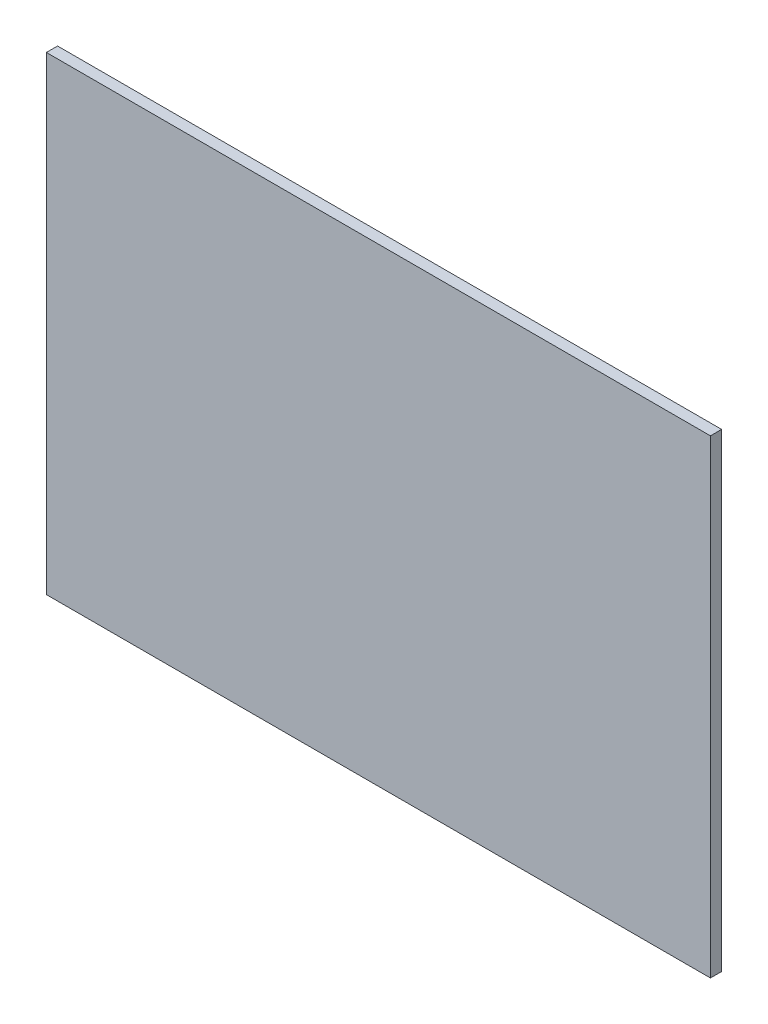
ISO-10303-21;
HEADER;
FILE_DESCRIPTION(('STEP AP214'),'2;1');
FILE_NAME('part.step','',(''),(''),'','','');
FILE_SCHEMA(('AUTOMOTIVE_DESIGN { 1 0 10303 214 1 1 1 1 }'));
ENDSEC;
DATA;
#1=APPLICATION_CONTEXT('core data for automotive mechanical design processes');
#2=APPLICATION_PROTOCOL_DEFINITION('international standard','automotive_design',2000,#1);
#3=PRODUCT_CONTEXT('',#1,'mechanical');
#4=PRODUCT('Part','Part','',(#3));
#5=PRODUCT_RELATED_PRODUCT_CATEGORY('part','',(#4));
#6=PRODUCT_DEFINITION_FORMATION('','',#4);
#7=PRODUCT_DEFINITION_CONTEXT('part definition',#1,'design');
#8=PRODUCT_DEFINITION('design','',#6,#7);
#9=PRODUCT_DEFINITION_SHAPE('','',#8);
#10=(LENGTH_UNIT() NAMED_UNIT(*) SI_UNIT(.MILLI.,.METRE.));
#11=(NAMED_UNIT(*) PLANE_ANGLE_UNIT() SI_UNIT($,.RADIAN.));
#12=(NAMED_UNIT(*) SI_UNIT($,.STERADIAN.) SOLID_ANGLE_UNIT());
#13=UNCERTAINTY_MEASURE_WITH_UNIT(LENGTH_MEASURE(1.E-05),#10,'distance_accuracy_value','');
#14=(GEOMETRIC_REPRESENTATION_CONTEXT(3) GLOBAL_UNCERTAINTY_ASSIGNED_CONTEXT((#13)) GLOBAL_UNIT_ASSIGNED_CONTEXT((#10,
#11,#12)) REPRESENTATION_CONTEXT('',''));
#15=CARTESIAN_POINT('',(0.,0.,0.));
#16=DIRECTION('',(0.,0.,1.));
#17=DIRECTION('',(1.,0.,0.));
#18=AXIS2_PLACEMENT_3D('',#15,#16,#17);
#19=CARTESIAN_POINT('',(0.,0.,5.));
#20=DIRECTION('',(-1.,0.,0.));
#21=DIRECTION('',(0.,0.,1.));
#22=AXIS2_PLACEMENT_3D('',#19,#20,#21);
#23=PLANE('',#22);
#24=DIRECTION('',(0.,1.,0.));
#25=VECTOR('',#24,1.);
#26=CARTESIAN_POINT('',(0.,0.,0.));
#27=LINE('',#26,#25);
#28=CARTESIAN_POINT('',(0.,-210.,0.));
#29=VERTEX_POINT('',#28);
#30=CARTESIAN_POINT('',(0.,0.,0.));
#31=VERTEX_POINT('',#30);
#32=EDGE_CURVE('E107',#29,#31,#27,.T.);
#33=ORIENTED_EDGE('',*,*,#32,.T.);
#34=DIRECTION('',(0.,0.,-1.));
#35=VECTOR('',#34,1.);
#36=CARTESIAN_POINT('',(0.,0.,5.));
#37=LINE('',#36,#35);
#38=CARTESIAN_POINT('',(0.,0.,5.));
#39=VERTEX_POINT('',#38);
#40=EDGE_CURVE('E11',#39,#31,#37,.T.);
#41=ORIENTED_EDGE('',*,*,#40,.F.);
#42=DIRECTION('',(0.,1.,0.));
#43=VECTOR('',#42,1.);
#44=CARTESIAN_POINT('',(0.,0.,5.));
#45=LINE('',#44,#43);
#46=CARTESIAN_POINT('',(0.,-210.,5.));
#47=VERTEX_POINT('',#46);
#48=EDGE_CURVE('E91',#47,#39,#45,.T.);
#49=ORIENTED_EDGE('',*,*,#48,.F.);
#50=DIRECTION('',(0.,0.,-1.));
#51=VECTOR('',#50,1.);
#52=CARTESIAN_POINT('',(0.,-210.,5.));
#53=LINE('',#52,#51);
#54=EDGE_CURVE('E103',#47,#29,#53,.T.);
#55=ORIENTED_EDGE('',*,*,#54,.T.);
#56=EDGE_LOOP('',(#33,#41,#49,#55));
#57=FACE_BOUND('',#56,.T.);
#58=ADVANCED_FACE('F39',(#57),#23,.F.);
#59=CARTESIAN_POINT('',(0.,0.,5.));
#60=DIRECTION('',(0.,-1.,0.));
#61=DIRECTION('',(1.,0.,0.));
#62=AXIS2_PLACEMENT_3D('',#59,#60,#61);
#63=PLANE('',#62);
#64=DIRECTION('',(-1.,0.,0.));
#65=VECTOR('',#64,1.);
#66=CARTESIAN_POINT('',(0.,0.,0.));
#67=LINE('',#66,#65);
#68=CARTESIAN_POINT('',(-297.,0.,0.));
#69=VERTEX_POINT('',#68);
#70=EDGE_CURVE('E96',#31,#69,#67,.T.);
#71=ORIENTED_EDGE('',*,*,#70,.T.);
#72=DIRECTION('',(0.,0.,-1.));
#73=VECTOR('',#72,1.);
#74=CARTESIAN_POINT('',(-297.,0.,5.));
#75=LINE('',#74,#73);
#76=CARTESIAN_POINT('',(-297.,0.,5.));
#77=VERTEX_POINT('',#76);
#78=EDGE_CURVE('E48',#77,#69,#75,.T.);
#79=ORIENTED_EDGE('',*,*,#78,.F.);
#80=DIRECTION('',(-1.,0.,0.));
#81=VECTOR('',#80,1.);
#82=CARTESIAN_POINT('',(0.,0.,5.));
#83=LINE('',#82,#81);
#84=EDGE_CURVE('E86',#39,#77,#83,.T.);
#85=ORIENTED_EDGE('',*,*,#84,.F.);
#86=ORIENTED_EDGE('',*,*,#40,.T.);
#87=EDGE_LOOP('',(#71,#79,#85,#86));
#88=FACE_BOUND('',#87,.T.);
#89=ADVANCED_FACE('F95',(#88),#63,.F.);
#90=CARTESIAN_POINT('',(-297.,0.,5.));
#91=DIRECTION('',(1.,0.,0.));
#92=DIRECTION('',(0.,0.,-1.));
#93=AXIS2_PLACEMENT_3D('',#90,#91,#92);
#94=PLANE('',#93);
#95=DIRECTION('',(0.,-1.,0.));
#96=VECTOR('',#95,1.);
#97=CARTESIAN_POINT('',(-297.,0.,0.));
#98=LINE('',#97,#96);
#99=CARTESIAN_POINT('',(-297.,-210.,0.));
#100=VERTEX_POINT('',#99);
#101=EDGE_CURVE('E73',#69,#100,#98,.T.);
#102=ORIENTED_EDGE('',*,*,#101,.T.);
#103=DIRECTION('',(0.,0.,-1.));
#104=VECTOR('',#103,1.);
#105=CARTESIAN_POINT('',(-297.,-210.,5.));
#106=LINE('',#105,#104);
#107=CARTESIAN_POINT('',(-297.,-210.,5.));
#108=VERTEX_POINT('',#107);
#109=EDGE_CURVE('E98',#108,#100,#106,.T.);
#110=ORIENTED_EDGE('',*,*,#109,.F.);
#111=DIRECTION('',(0.,-1.,0.));
#112=VECTOR('',#111,1.);
#113=CARTESIAN_POINT('',(-297.,0.,5.));
#114=LINE('',#113,#112);
#115=EDGE_CURVE('E89',#77,#108,#114,.T.);
#116=ORIENTED_EDGE('',*,*,#115,.F.);
#117=ORIENTED_EDGE('',*,*,#78,.T.);
#118=EDGE_LOOP('',(#102,#110,#116,#117));
#119=FACE_BOUND('',#118,.T.);
#120=ADVANCED_FACE('F99',(#119),#94,.F.);
#121=CARTESIAN_POINT('',(0.,-210.,5.));
#122=DIRECTION('',(0.,1.,0.));
#123=DIRECTION('',(-1.,0.,0.));
#124=AXIS2_PLACEMENT_3D('',#121,#122,#123);
#125=PLANE('',#124);
#126=DIRECTION('',(1.,0.,0.));
#127=VECTOR('',#126,1.);
#128=CARTESIAN_POINT('',(0.,-210.,0.));
#129=LINE('',#128,#127);
#130=EDGE_CURVE('E79',#100,#29,#129,.T.);
#131=ORIENTED_EDGE('',*,*,#130,.T.);
#132=ORIENTED_EDGE('',*,*,#54,.F.);
#133=DIRECTION('',(1.,0.,0.));
#134=VECTOR('',#133,1.);
#135=CARTESIAN_POINT('',(0.,-210.,5.));
#136=LINE('',#135,#134);
#137=EDGE_CURVE('E56',#108,#47,#136,.T.);
#138=ORIENTED_EDGE('',*,*,#137,.F.);
#139=ORIENTED_EDGE('',*,*,#109,.T.);
#140=EDGE_LOOP('',(#131,#132,#138,#139));
#141=FACE_BOUND('',#140,.T.);
#142=ADVANCED_FACE('F120',(#141),#125,.F.);
#143=CARTESIAN_POINT('',(0.,0.,5.));
#144=DIRECTION('',(0.,0.,-1.));
#145=DIRECTION('',(-1.,0.,0.));
#146=AXIS2_PLACEMENT_3D('',#143,#144,#145);
#147=PLANE('',#146);
#148=ORIENTED_EDGE('',*,*,#48,.T.);
#149=ORIENTED_EDGE('',*,*,#84,.T.);
#150=ORIENTED_EDGE('',*,*,#115,.T.);
#151=ORIENTED_EDGE('',*,*,#137,.T.);
#152=EDGE_LOOP('',(#148,#149,#150,#151));
#153=FACE_BOUND('',#152,.T.);
#154=ADVANCED_FACE('F87',(#153),#147,.F.);
#155=CARTESIAN_POINT('',(0.,0.,0.));
#156=DIRECTION('',(0.,0.,-1.));
#157=DIRECTION('',(-1.,0.,0.));
#158=AXIS2_PLACEMENT_3D('',#155,#156,#157);
#159=PLANE('',#158);
#160=ORIENTED_EDGE('',*,*,#32,.F.);
#161=ORIENTED_EDGE('',*,*,#130,.F.);
#162=ORIENTED_EDGE('',*,*,#101,.F.);
#163=ORIENTED_EDGE('',*,*,#70,.F.);
#164=EDGE_LOOP('',(#160,#161,#162,#163));
#165=FACE_BOUND('',#164,.T.);
#166=ADVANCED_FACE('F123',(#165),#159,.T.);
#167=CLOSED_SHELL('',(#58,#89,#120,#142,#154,#166));
#168=MANIFOLD_SOLID_BREP('B2',#167);
#169=ADVANCED_BREP_SHAPE_REPRESENTATION('',(#18,#168),#14);
#170=SHAPE_DEFINITION_REPRESENTATION(#9,#169);
ENDSEC;
END-ISO-10303-21;
